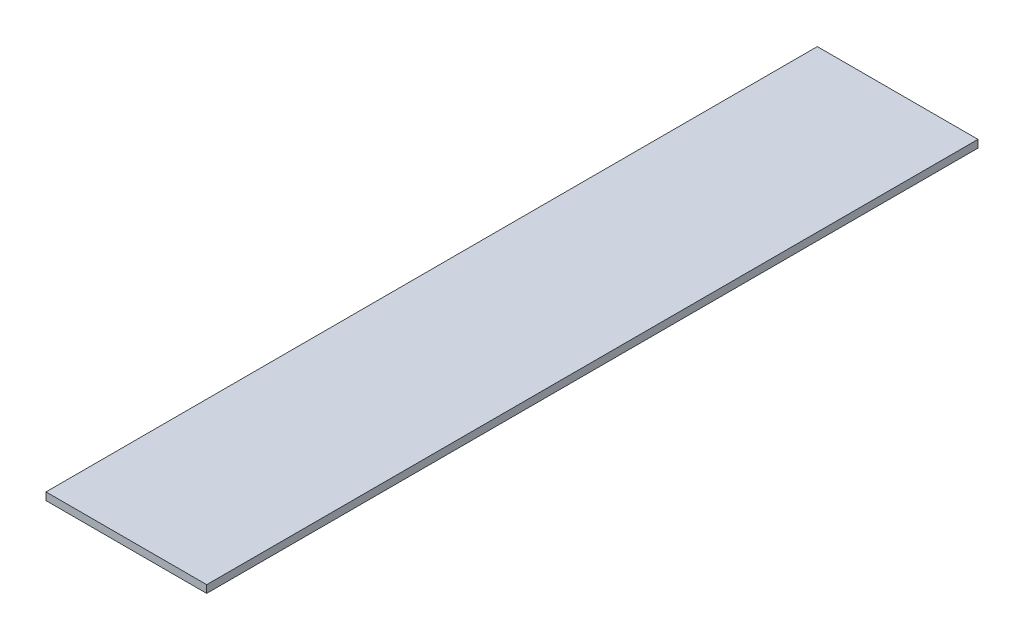
ISO-10303-21;
HEADER;
FILE_DESCRIPTION(('STEP AP214'),'2;1');
FILE_NAME('part.step','',(''),(''),'','','');
FILE_SCHEMA(('AUTOMOTIVE_DESIGN { 1 0 10303 214 1 1 1 1 }'));
ENDSEC;
DATA;
#1=APPLICATION_CONTEXT('core data for automotive mechanical design processes');
#2=APPLICATION_PROTOCOL_DEFINITION('international standard','automotive_design',2000,#1);
#3=PRODUCT_CONTEXT('',#1,'mechanical');
#4=PRODUCT('Part','Part','',(#3));
#5=PRODUCT_RELATED_PRODUCT_CATEGORY('part','',(#4));
#6=PRODUCT_DEFINITION_FORMATION('','',#4);
#7=PRODUCT_DEFINITION_CONTEXT('part definition',#1,'design');
#8=PRODUCT_DEFINITION('design','',#6,#7);
#9=PRODUCT_DEFINITION_SHAPE('','',#8);
#10=(LENGTH_UNIT() NAMED_UNIT(*) SI_UNIT(.MILLI.,.METRE.));
#11=(NAMED_UNIT(*) PLANE_ANGLE_UNIT() SI_UNIT($,.RADIAN.));
#12=(NAMED_UNIT(*) SI_UNIT($,.STERADIAN.) SOLID_ANGLE_UNIT());
#13=UNCERTAINTY_MEASURE_WITH_UNIT(LENGTH_MEASURE(1.E-05),#10,'distance_accuracy_value','');
#14=(GEOMETRIC_REPRESENTATION_CONTEXT(3) GLOBAL_UNCERTAINTY_ASSIGNED_CONTEXT((#13)) GLOBAL_UNIT_ASSIGNED_CONTEXT((#10,
#11,#12)) REPRESENTATION_CONTEXT('',''));
#15=CARTESIAN_POINT('',(0.,0.,0.));
#16=DIRECTION('',(0.,0.,1.));
#17=DIRECTION('',(1.,0.,0.));
#18=AXIS2_PLACEMENT_3D('',#15,#16,#17);
#19=CARTESIAN_POINT('',(12.5,1.18,60.));
#20=DIRECTION('',(-1.,0.,0.));
#21=DIRECTION('',(0.,0.,1.));
#22=AXIS2_PLACEMENT_3D('',#19,#20,#21);
#23=PLANE('',#22);
#24=DIRECTION('',(0.,0.,-1.));
#25=VECTOR('',#24,1.);
#26=CARTESIAN_POINT('',(12.5,0.,60.));
#27=LINE('',#26,#25);
#28=CARTESIAN_POINT('',(12.5,0.,60.));
#29=VERTEX_POINT('',#28);
#30=CARTESIAN_POINT('',(12.5,0.,-60.));
#31=VERTEX_POINT('',#30);
#32=EDGE_CURVE('E107',#29,#31,#27,.T.);
#33=ORIENTED_EDGE('',*,*,#32,.T.);
#34=DIRECTION('',(0.,-1.,0.));
#35=VECTOR('',#34,1.);
#36=CARTESIAN_POINT('',(12.5,1.18,-60.));
#37=LINE('',#36,#35);
#38=CARTESIAN_POINT('',(12.5,1.18,-60.));
#39=VERTEX_POINT('',#38);
#40=EDGE_CURVE('E11',#39,#31,#37,.T.);
#41=ORIENTED_EDGE('',*,*,#40,.F.);
#42=DIRECTION('',(0.,0.,-1.));
#43=VECTOR('',#42,1.);
#44=CARTESIAN_POINT('',(12.5,1.18,60.));
#45=LINE('',#44,#43);
#46=CARTESIAN_POINT('',(12.5,1.18,60.));
#47=VERTEX_POINT('',#46);
#48=EDGE_CURVE('E91',#47,#39,#45,.T.);
#49=ORIENTED_EDGE('',*,*,#48,.F.);
#50=DIRECTION('',(0.,-1.,0.));
#51=VECTOR('',#50,1.);
#52=CARTESIAN_POINT('',(12.5,1.18,60.));
#53=LINE('',#52,#51);
#54=EDGE_CURVE('E103',#47,#29,#53,.T.);
#55=ORIENTED_EDGE('',*,*,#54,.T.);
#56=EDGE_LOOP('',(#33,#41,#49,#55));
#57=FACE_BOUND('',#56,.T.);
#58=ADVANCED_FACE('F39',(#57),#23,.F.);
#59=CARTESIAN_POINT('',(-12.5,1.18,-60.));
#60=DIRECTION('',(0.,0.,1.));
#61=DIRECTION('',(1.,0.,0.));
#62=AXIS2_PLACEMENT_3D('',#59,#60,#61);
#63=PLANE('',#62);
#64=DIRECTION('',(-1.,0.,0.));
#65=VECTOR('',#64,1.);
#66=CARTESIAN_POINT('',(-12.5,0.,-60.));
#67=LINE('',#66,#65);
#68=CARTESIAN_POINT('',(-12.5,0.,-60.));
#69=VERTEX_POINT('',#68);
#70=EDGE_CURVE('E96',#31,#69,#67,.T.);
#71=ORIENTED_EDGE('',*,*,#70,.T.);
#72=DIRECTION('',(0.,-1.,0.));
#73=VECTOR('',#72,1.);
#74=CARTESIAN_POINT('',(-12.5,1.18,-60.));
#75=LINE('',#74,#73);
#76=CARTESIAN_POINT('',(-12.5,1.18,-60.));
#77=VERTEX_POINT('',#76);
#78=EDGE_CURVE('E48',#77,#69,#75,.T.);
#79=ORIENTED_EDGE('',*,*,#78,.F.);
#80=DIRECTION('',(-1.,0.,0.));
#81=VECTOR('',#80,1.);
#82=CARTESIAN_POINT('',(-12.5,1.18,-60.));
#83=LINE('',#82,#81);
#84=EDGE_CURVE('E86',#39,#77,#83,.T.);
#85=ORIENTED_EDGE('',*,*,#84,.F.);
#86=ORIENTED_EDGE('',*,*,#40,.T.);
#87=EDGE_LOOP('',(#71,#79,#85,#86));
#88=FACE_BOUND('',#87,.T.);
#89=ADVANCED_FACE('F95',(#88),#63,.F.);
#90=CARTESIAN_POINT('',(-12.5,1.18,60.));
#91=DIRECTION('',(1.,0.,0.));
#92=DIRECTION('',(0.,0.,-1.));
#93=AXIS2_PLACEMENT_3D('',#90,#91,#92);
#94=PLANE('',#93);
#95=DIRECTION('',(0.,0.,1.));
#96=VECTOR('',#95,1.);
#97=CARTESIAN_POINT('',(-12.5,0.,60.));
#98=LINE('',#97,#96);
#99=CARTESIAN_POINT('',(-12.5,0.,60.));
#100=VERTEX_POINT('',#99);
#101=EDGE_CURVE('E73',#69,#100,#98,.T.);
#102=ORIENTED_EDGE('',*,*,#101,.T.);
#103=DIRECTION('',(0.,-1.,0.));
#104=VECTOR('',#103,1.);
#105=CARTESIAN_POINT('',(-12.5,1.18,60.));
#106=LINE('',#105,#104);
#107=CARTESIAN_POINT('',(-12.5,1.18,60.));
#108=VERTEX_POINT('',#107);
#109=EDGE_CURVE('E98',#108,#100,#106,.T.);
#110=ORIENTED_EDGE('',*,*,#109,.F.);
#111=DIRECTION('',(0.,0.,1.));
#112=VECTOR('',#111,1.);
#113=CARTESIAN_POINT('',(-12.5,1.18,60.));
#114=LINE('',#113,#112);
#115=EDGE_CURVE('E89',#77,#108,#114,.T.);
#116=ORIENTED_EDGE('',*,*,#115,.F.);
#117=ORIENTED_EDGE('',*,*,#78,.T.);
#118=EDGE_LOOP('',(#102,#110,#116,#117));
#119=FACE_BOUND('',#118,.T.);
#120=ADVANCED_FACE('F99',(#119),#94,.F.);
#121=CARTESIAN_POINT('',(-12.5,1.18,60.));
#122=DIRECTION('',(0.,0.,-1.));
#123=DIRECTION('',(-1.,0.,0.));
#124=AXIS2_PLACEMENT_3D('',#121,#122,#123);
#125=PLANE('',#124);
#126=DIRECTION('',(1.,0.,0.));
#127=VECTOR('',#126,1.);
#128=CARTESIAN_POINT('',(-12.5,0.,60.));
#129=LINE('',#128,#127);
#130=EDGE_CURVE('E79',#100,#29,#129,.T.);
#131=ORIENTED_EDGE('',*,*,#130,.T.);
#132=ORIENTED_EDGE('',*,*,#54,.F.);
#133=DIRECTION('',(1.,0.,0.));
#134=VECTOR('',#133,1.);
#135=CARTESIAN_POINT('',(-12.5,1.18,60.));
#136=LINE('',#135,#134);
#137=EDGE_CURVE('E56',#108,#47,#136,.T.);
#138=ORIENTED_EDGE('',*,*,#137,.F.);
#139=ORIENTED_EDGE('',*,*,#109,.T.);
#140=EDGE_LOOP('',(#131,#132,#138,#139));
#141=FACE_BOUND('',#140,.T.);
#142=ADVANCED_FACE('F120',(#141),#125,.F.);
#143=CARTESIAN_POINT('',(0.,1.18,0.));
#144=DIRECTION('',(0.,-1.,0.));
#145=DIRECTION('',(0.,0.,-1.));
#146=AXIS2_PLACEMENT_3D('',#143,#144,#145);
#147=PLANE('',#146);
#148=ORIENTED_EDGE('',*,*,#48,.T.);
#149=ORIENTED_EDGE('',*,*,#84,.T.);
#150=ORIENTED_EDGE('',*,*,#115,.T.);
#151=ORIENTED_EDGE('',*,*,#137,.T.);
#152=EDGE_LOOP('',(#148,#149,#150,#151));
#153=FACE_BOUND('',#152,.T.);
#154=ADVANCED_FACE('F87',(#153),#147,.F.);
#155=CARTESIAN_POINT('',(0.,0.,0.));
#156=DIRECTION('',(0.,-1.,0.));
#157=DIRECTION('',(0.,0.,-1.));
#158=AXIS2_PLACEMENT_3D('',#155,#156,#157);
#159=PLANE('',#158);
#160=ORIENTED_EDGE('',*,*,#32,.F.);
#161=ORIENTED_EDGE('',*,*,#130,.F.);
#162=ORIENTED_EDGE('',*,*,#101,.F.);
#163=ORIENTED_EDGE('',*,*,#70,.F.);
#164=EDGE_LOOP('',(#160,#161,#162,#163));
#165=FACE_BOUND('',#164,.T.);
#166=ADVANCED_FACE('F123',(#165),#159,.T.);
#167=CLOSED_SHELL('',(#58,#89,#120,#142,#154,#166));
#168=MANIFOLD_SOLID_BREP('B2',#167);
#169=ADVANCED_BREP_SHAPE_REPRESENTATION('',(#18,#168),#14);
#170=SHAPE_DEFINITION_REPRESENTATION(#9,#169);
ENDSEC;
END-ISO-10303-21;
